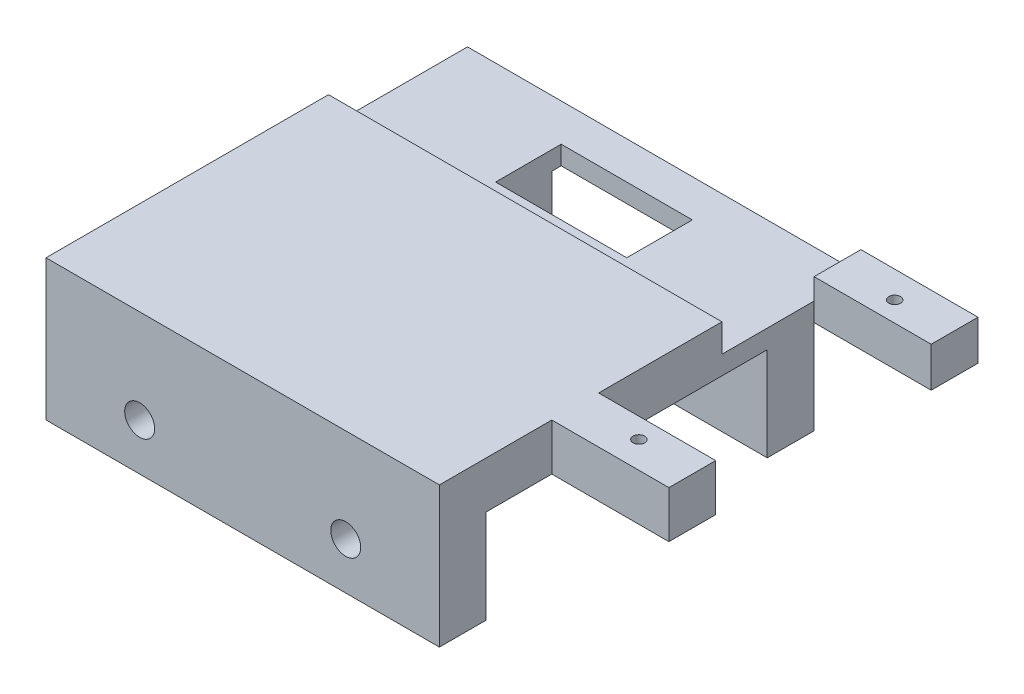
ISO-10303-21;
HEADER;
FILE_DESCRIPTION(('STEP AP214'),'2;1');
FILE_NAME('part.step','',(''),(''),'','','');
FILE_SCHEMA(('AUTOMOTIVE_DESIGN { 1 0 10303 214 1 1 1 1 }'));
ENDSEC;
DATA;
#1=APPLICATION_CONTEXT('core data for automotive mechanical design processes');
#2=APPLICATION_PROTOCOL_DEFINITION('international standard','automotive_design',2000,#1);
#3=PRODUCT_CONTEXT('',#1,'mechanical');
#4=PRODUCT('Part','Part','',(#3));
#5=PRODUCT_RELATED_PRODUCT_CATEGORY('part','',(#4));
#6=PRODUCT_DEFINITION_FORMATION('','',#4);
#7=PRODUCT_DEFINITION_CONTEXT('part definition',#1,'design');
#8=PRODUCT_DEFINITION('design','',#6,#7);
#9=PRODUCT_DEFINITION_SHAPE('','',#8);
#10=(LENGTH_UNIT() NAMED_UNIT(*) SI_UNIT(.MILLI.,.METRE.));
#11=(NAMED_UNIT(*) PLANE_ANGLE_UNIT() SI_UNIT($,.RADIAN.));
#12=(NAMED_UNIT(*) SI_UNIT($,.STERADIAN.) SOLID_ANGLE_UNIT());
#13=UNCERTAINTY_MEASURE_WITH_UNIT(LENGTH_MEASURE(1.E-05),#10,'distance_accuracy_value','');
#14=(GEOMETRIC_REPRESENTATION_CONTEXT(3) GLOBAL_UNCERTAINTY_ASSIGNED_CONTEXT((#13)) GLOBAL_UNIT_ASSIGNED_CONTEXT((#10,
#11,#12)) REPRESENTATION_CONTEXT('',''));
#15=CARTESIAN_POINT('',(0.,0.,0.));
#16=DIRECTION('',(0.,0.,1.));
#17=DIRECTION('',(1.,0.,0.));
#18=AXIS2_PLACEMENT_3D('',#15,#16,#17);
#19=CARTESIAN_POINT('',(42.,5.,0.));
#20=DIRECTION('',(-1.,0.,0.));
#21=DIRECTION('',(0.,0.,1.));
#22=AXIS2_PLACEMENT_3D('',#19,#20,#21);
#23=PLANE('',#22);
#24=DIRECTION('',(0.,-1.,0.));
#25=VECTOR('',#24,1.);
#26=CARTESIAN_POINT('',(42.,0.,5.));
#27=LINE('',#26,#25);
#28=CARTESIAN_POINT('',(42.,2.,5.));
#29=VERTEX_POINT('',#28);
#30=CARTESIAN_POINT('',(42.,0.,5.));
#31=VERTEX_POINT('',#30);
#32=EDGE_CURVE('E259',#29,#31,#27,.T.);
#33=ORIENTED_EDGE('',*,*,#32,.F.);
#34=DIRECTION('',(0.,0.,-1.));
#35=VECTOR('',#34,1.);
#36=CARTESIAN_POINT('',(42.,2.,0.));
#37=LINE('',#36,#35);
#38=CARTESIAN_POINT('',(42.,2.,14.8381003814202));
#39=VERTEX_POINT('',#38);
#40=EDGE_CURVE('E324',#39,#29,#37,.T.);
#41=ORIENTED_EDGE('',*,*,#40,.F.);
#42=DIRECTION('',(0.,1.,0.));
#43=VECTOR('',#42,1.);
#44=CARTESIAN_POINT('',(42.,2.,14.8381003814202));
#45=LINE('',#44,#43);
#46=CARTESIAN_POINT('',(42.,5.,14.8381003814202));
#47=VERTEX_POINT('',#46);
#48=EDGE_CURVE('E332',#39,#47,#45,.T.);
#49=ORIENTED_EDGE('',*,*,#48,.T.);
#50=DIRECTION('',(0.,0.,-1.));
#51=VECTOR('',#50,1.);
#52=CARTESIAN_POINT('',(42.,5.,0.));
#53=LINE('',#52,#51);
#54=CARTESIAN_POINT('',(42.,5.,28.));
#55=VERTEX_POINT('',#54);
#56=EDGE_CURVE('E445',#55,#47,#53,.T.);
#57=ORIENTED_EDGE('',*,*,#56,.F.);
#58=DIRECTION('',(0.,1.,0.));
#59=VECTOR('',#58,1.);
#60=CARTESIAN_POINT('',(42.,0.,28.));
#61=LINE('',#60,#59);
#62=CARTESIAN_POINT('',(42.,0.,28.));
#63=VERTEX_POINT('',#62);
#64=EDGE_CURVE('E68',#63,#55,#61,.T.);
#65=ORIENTED_EDGE('',*,*,#64,.F.);
#66=DIRECTION('',(0.,0.,-1.));
#67=VECTOR('',#66,1.);
#68=CARTESIAN_POINT('',(42.,0.,0.));
#69=LINE('',#68,#67);
#70=CARTESIAN_POINT('',(42.,0.,10.));
#71=VERTEX_POINT('',#70);
#72=EDGE_CURVE('E452',#63,#71,#69,.T.);
#73=ORIENTED_EDGE('',*,*,#72,.T.);
#74=DIRECTION('',(0.,1.,0.));
#75=VECTOR('',#74,1.);
#76=CARTESIAN_POINT('',(42.,-10.,10.));
#77=LINE('',#76,#75);
#78=CARTESIAN_POINT('',(42.,-10.,10.));
#79=VERTEX_POINT('',#78);
#80=EDGE_CURVE('E411',#79,#71,#77,.T.);
#81=ORIENTED_EDGE('',*,*,#80,.F.);
#82=DIRECTION('',(0.,0.,1.));
#83=VECTOR('',#82,1.);
#84=CARTESIAN_POINT('',(42.,-10.,10.));
#85=LINE('',#84,#83);
#86=CARTESIAN_POINT('',(42.,-10.,5.));
#87=VERTEX_POINT('',#86);
#88=EDGE_CURVE('E404',#87,#79,#85,.T.);
#89=ORIENTED_EDGE('',*,*,#88,.F.);
#90=DIRECTION('',(0.,1.,0.));
#91=VECTOR('',#90,1.);
#92=CARTESIAN_POINT('',(42.,-10.,5.));
#93=LINE('',#92,#91);
#94=EDGE_CURVE('E421',#87,#31,#93,.T.);
#95=ORIENTED_EDGE('',*,*,#94,.T.);
#96=EDGE_LOOP('',(#33,#41,#49,#57,#65,#73,#81,#89,#95));
#97=FACE_BOUND('',#96,.T.);
#98=ADVANCED_FACE('F51',(#97),#23,.F.);
#99=DIRECTION('',(0.,-1.,0.));
#100=VECTOR('',#99,1.);
#101=CARTESIAN_POINT('',(42.,0.,33.));
#102=LINE('',#101,#100);
#103=CARTESIAN_POINT('',(42.,5.,33.));
#104=VERTEX_POINT('',#103);
#105=CARTESIAN_POINT('',(42.,0.,33.));
#106=VERTEX_POINT('',#105);
#107=EDGE_CURVE('E260',#104,#106,#102,.T.);
#108=ORIENTED_EDGE('',*,*,#107,.F.);
#109=CARTESIAN_POINT('',(42.,5.,45.));
#110=VERTEX_POINT('',#109);
#111=EDGE_CURVE('E446',#110,#104,#53,.T.);
#112=ORIENTED_EDGE('',*,*,#111,.F.);
#113=DIRECTION('',(0.,-1.,0.));
#114=VECTOR('',#113,1.);
#115=CARTESIAN_POINT('',(42.,5.,45.));
#116=LINE('',#115,#114);
#117=CARTESIAN_POINT('',(42.,-10.,45.));
#118=VERTEX_POINT('',#117);
#119=EDGE_CURVE('E456',#110,#118,#116,.T.);
#120=ORIENTED_EDGE('',*,*,#119,.T.);
#121=DIRECTION('',(0.,0.,1.));
#122=VECTOR('',#121,1.);
#123=CARTESIAN_POINT('',(42.,-10.,45.));
#124=LINE('',#123,#122);
#125=CARTESIAN_POINT('',(42.,-10.,40.));
#126=VERTEX_POINT('',#125);
#127=EDGE_CURVE('E431',#126,#118,#124,.T.);
#128=ORIENTED_EDGE('',*,*,#127,.F.);
#129=DIRECTION('',(0.,1.,0.));
#130=VECTOR('',#129,1.);
#131=CARTESIAN_POINT('',(42.,-10.,40.));
#132=LINE('',#131,#130);
#133=CARTESIAN_POINT('',(42.,0.,40.));
#134=VERTEX_POINT('',#133);
#135=EDGE_CURVE('E437',#126,#134,#132,.T.);
#136=ORIENTED_EDGE('',*,*,#135,.T.);
#137=EDGE_CURVE('E76',#134,#106,#69,.T.);
#138=ORIENTED_EDGE('',*,*,#137,.T.);
#139=EDGE_LOOP('',(#108,#112,#120,#128,#136,#138));
#140=FACE_BOUND('',#139,.T.);
#141=ADVANCED_FACE('F474',(#140),#23,.F.);
#142=CARTESIAN_POINT('',(0.,-5.,35.));
#143=DIRECTION('',(1.,0.,0.));
#144=DIRECTION('',(0.,0.,-1.));
#145=AXIS2_PLACEMENT_3D('',#142,#143,#144);
#146=CYLINDRICAL_SURFACE('',#145,1.75);
#147=CARTESIAN_POINT('',(0.,-5.,35.));
#148=DIRECTION('',(1.,0.,0.));
#149=DIRECTION('',(0.,0.,-1.));
#150=AXIS2_PLACEMENT_3D('',#147,#148,#149);
#151=CIRCLE('',#150,1.75);
#152=CARTESIAN_POINT('',(0.,-5.,33.25));
#153=VERTEX_POINT('',#152);
#154=EDGE_CURVE('E298',#153,#153,#151,.T.);
#155=ORIENTED_EDGE('',*,*,#154,.F.);
#156=EDGE_LOOP('',(#155));
#157=FACE_BOUND('',#156,.T.);
#158=CARTESIAN_POINT('',(3.,-5.,35.));
#159=DIRECTION('',(1.,0.,0.));
#160=DIRECTION('',(0.,0.,-1.));
#161=AXIS2_PLACEMENT_3D('',#158,#159,#160);
#162=CIRCLE('',#161,1.75);
#163=CARTESIAN_POINT('',(3.,-5.,33.25));
#164=VERTEX_POINT('',#163);
#165=EDGE_CURVE('E295',#164,#164,#162,.F.);
#166=ORIENTED_EDGE('',*,*,#165,.F.);
#167=EDGE_LOOP('',(#166));
#168=FACE_BOUND('',#167,.T.);
#169=ADVANCED_FACE('F471',(#157,#168),#146,.F.);
#170=CARTESIAN_POINT('',(0.,0.,0.));
#171=DIRECTION('',(0.,1.,0.));
#172=DIRECTION('',(0.,0.,1.));
#173=AXIS2_PLACEMENT_3D('',#170,#171,#172);
#174=PLANE('',#173);
#175=CARTESIAN_POINT('',(48.45,0.,30.1500000000016));
#176=DIRECTION('',(0.,-1.,0.));
#177=DIRECTION('',(0.,0.,-1.));
#178=AXIS2_PLACEMENT_3D('',#175,#176,#177);
#179=CIRCLE('',#178,0.624999999999977);
#180=CARTESIAN_POINT('',(48.45,0.,29.5250000000016));
#181=VERTEX_POINT('',#180);
#182=EDGE_CURVE('E634',#181,#181,#179,.T.);
#183=ORIENTED_EDGE('',*,*,#182,.F.);
#184=EDGE_LOOP('',(#183));
#185=FACE_BOUND('',#184,.T.);
#186=DIRECTION('',(0.,0.,1.));
#187=VECTOR('',#186,1.);
#188=CARTESIAN_POINT('',(5.,0.,10.));
#189=LINE('',#188,#187);
#190=CARTESIAN_POINT('',(5.,0.,10.));
#191=VERTEX_POINT('',#190);
#192=CARTESIAN_POINT('',(5.,0.,40.));
#193=VERTEX_POINT('',#192);
#194=EDGE_CURVE('E301',#191,#193,#189,.T.);
#195=ORIENTED_EDGE('',*,*,#194,.F.);
#196=DIRECTION('',(-1.,0.,0.));
#197=VECTOR('',#196,1.);
#198=CARTESIAN_POINT('',(0.,0.,10.));
#199=LINE('',#198,#197);
#200=CARTESIAN_POINT('',(14.,0.,10.));
#201=VERTEX_POINT('',#200);
#202=EDGE_CURVE('E415',#201,#191,#199,.T.);
#203=ORIENTED_EDGE('',*,*,#202,.F.);
#204=DIRECTION('',(0.,0.,1.));
#205=VECTOR('',#204,1.);
#206=CARTESIAN_POINT('',(14.,0.,0.));
#207=LINE('',#206,#205);
#208=CARTESIAN_POINT('',(14.,0.,11.));
#209=VERTEX_POINT('',#208);
#210=EDGE_CURVE('E353',#201,#209,#207,.T.);
#211=ORIENTED_EDGE('',*,*,#210,.T.);
#212=DIRECTION('',(1.,0.,0.));
#213=VECTOR('',#212,1.);
#214=CARTESIAN_POINT('',(0.,0.,11.));
#215=LINE('',#214,#213);
#216=CARTESIAN_POINT('',(28.,0.,11.));
#217=VERTEX_POINT('',#216);
#218=EDGE_CURVE('E374',#209,#217,#215,.T.);
#219=ORIENTED_EDGE('',*,*,#218,.T.);
#220=DIRECTION('',(0.,0.,-1.));
#221=VECTOR('',#220,1.);
#222=CARTESIAN_POINT('',(28.,0.,0.));
#223=LINE('',#222,#221);
#224=CARTESIAN_POINT('',(28.,0.,10.));
#225=VERTEX_POINT('',#224);
#226=EDGE_CURVE('E365',#217,#225,#223,.T.);
#227=ORIENTED_EDGE('',*,*,#226,.T.);
#228=EDGE_CURVE('E416',#71,#225,#199,.T.);
#229=ORIENTED_EDGE('',*,*,#228,.F.);
#230=ORIENTED_EDGE('',*,*,#72,.F.);
#231=DIRECTION('',(-1.,0.,0.));
#232=VECTOR('',#231,1.);
#233=CARTESIAN_POINT('',(54.5,0.,28.));
#234=LINE('',#233,#232);
#235=CARTESIAN_POINT('',(54.5,0.,28.));
#236=VERTEX_POINT('',#235);
#237=EDGE_CURVE('E286',#236,#63,#234,.T.);
#238=ORIENTED_EDGE('',*,*,#237,.F.);
#239=DIRECTION('',(0.,0.,-1.));
#240=VECTOR('',#239,1.);
#241=CARTESIAN_POINT('',(54.5,0.,33.));
#242=LINE('',#241,#240);
#243=CARTESIAN_POINT('',(54.5,0.,33.));
#244=VERTEX_POINT('',#243);
#245=EDGE_CURVE('E273',#244,#236,#242,.T.);
#246=ORIENTED_EDGE('',*,*,#245,.F.);
#247=DIRECTION('',(-1.,0.,0.));
#248=VECTOR('',#247,1.);
#249=CARTESIAN_POINT('',(54.5,0.,33.));
#250=LINE('',#249,#248);
#251=EDGE_CURVE('E289',#244,#106,#250,.T.);
#252=ORIENTED_EDGE('',*,*,#251,.T.);
#253=ORIENTED_EDGE('',*,*,#137,.F.);
#254=DIRECTION('',(1.,0.,0.));
#255=VECTOR('',#254,1.);
#256=CARTESIAN_POINT('',(0.,0.,40.));
#257=LINE('',#256,#255);
#258=EDGE_CURVE('E426',#193,#134,#257,.T.);
#259=ORIENTED_EDGE('',*,*,#258,.F.);
#260=EDGE_LOOP('',(#195,#203,#211,#219,#227,#229,#230,#238,#246,#252,#253,#259));
#261=FACE_BOUND('',#260,.T.);
#262=ADVANCED_FACE('F473',(#185,#261),#174,.F.);
#263=CARTESIAN_POINT('',(0.,-10.,40.));
#264=DIRECTION('',(0.,0.,1.));
#265=DIRECTION('',(1.,0.,0.));
#266=AXIS2_PLACEMENT_3D('',#263,#264,#265);
#267=PLANE('',#266);
#268=CARTESIAN_POINT('',(10.,-5.,40.));
#269=DIRECTION('',(0.,0.,1.));
#270=DIRECTION('',(1.,0.,0.));
#271=AXIS2_PLACEMENT_3D('',#268,#269,#270);
#272=CIRCLE('',#271,1.6);
#273=CARTESIAN_POINT('',(11.6,-5.,40.));
#274=VERTEX_POINT('',#273);
#275=EDGE_CURVE('E393',#274,#274,#272,.T.);
#276=ORIENTED_EDGE('',*,*,#275,.T.);
#277=EDGE_LOOP('',(#276));
#278=FACE_BOUND('',#277,.T.);
#279=CARTESIAN_POINT('',(32.,-5.,40.));
#280=DIRECTION('',(0.,0.,1.));
#281=DIRECTION('',(1.,0.,0.));
#282=AXIS2_PLACEMENT_3D('',#279,#280,#281);
#283=CIRCLE('',#282,1.6);
#284=CARTESIAN_POINT('',(33.6,-5.,40.));
#285=VERTEX_POINT('',#284);
#286=EDGE_CURVE('E397',#285,#285,#283,.T.);
#287=ORIENTED_EDGE('',*,*,#286,.T.);
#288=EDGE_LOOP('',(#287));
#289=FACE_BOUND('',#288,.T.);
#290=DIRECTION('',(0.,1.,0.));
#291=VECTOR('',#290,1.);
#292=CARTESIAN_POINT('',(5.,-10.,40.));
#293=LINE('',#292,#291);
#294=CARTESIAN_POINT('',(5.,-10.,40.));
#295=VERTEX_POINT('',#294);
#296=EDGE_CURVE('E310',#295,#193,#293,.T.);
#297=ORIENTED_EDGE('',*,*,#296,.T.);
#298=ORIENTED_EDGE('',*,*,#258,.T.);
#299=ORIENTED_EDGE('',*,*,#135,.F.);
#300=DIRECTION('',(1.,0.,0.));
#301=VECTOR('',#300,1.);
#302=CARTESIAN_POINT('',(0.,-10.,40.));
#303=LINE('',#302,#301);
#304=EDGE_CURVE('E429',#295,#126,#303,.T.);
#305=ORIENTED_EDGE('',*,*,#304,.F.);
#306=EDGE_LOOP('',(#297,#298,#299,#305));
#307=FACE_BOUND('',#306,.T.);
#308=ADVANCED_FACE('F482',(#278,#289,#307),#267,.F.);
#309=CARTESIAN_POINT('',(0.,-10.,10.));
#310=DIRECTION('',(0.,0.,-1.));
#311=DIRECTION('',(-1.,0.,0.));
#312=AXIS2_PLACEMENT_3D('',#309,#310,#311);
#313=PLANE('',#312);
#314=CARTESIAN_POINT('',(10.,-5.,10.));
#315=DIRECTION('',(0.,0.,-1.));
#316=DIRECTION('',(-1.,0.,0.));
#317=AXIS2_PLACEMENT_3D('',#314,#315,#316);
#318=CIRCLE('',#317,1.6);
#319=CARTESIAN_POINT('',(8.4,-5.,10.));
#320=VERTEX_POINT('',#319);
#321=EDGE_CURVE('E384',#320,#320,#318,.T.);
#322=ORIENTED_EDGE('',*,*,#321,.T.);
#323=EDGE_LOOP('',(#322));
#324=FACE_BOUND('',#323,.T.);
#325=DIRECTION('',(0.,1.,0.));
#326=VECTOR('',#325,1.);
#327=CARTESIAN_POINT('',(5.,-10.,10.));
#328=LINE('',#327,#326);
#329=CARTESIAN_POINT('',(5.,-10.,10.));
#330=VERTEX_POINT('',#329);
#331=EDGE_CURVE('E314',#330,#191,#328,.T.);
#332=ORIENTED_EDGE('',*,*,#331,.F.);
#333=DIRECTION('',(-1.,0.,0.));
#334=VECTOR('',#333,1.);
#335=CARTESIAN_POINT('',(0.,-10.,10.));
#336=LINE('',#335,#334);
#337=CARTESIAN_POINT('',(14.,-10.,10.));
#338=VERTEX_POINT('',#337);
#339=EDGE_CURVE('E407',#338,#330,#336,.T.);
#340=ORIENTED_EDGE('',*,*,#339,.F.);
#341=DIRECTION('',(0.,1.,0.));
#342=VECTOR('',#341,1.);
#343=CARTESIAN_POINT('',(14.,-10.,10.));
#344=LINE('',#343,#342);
#345=EDGE_CURVE('E345',#338,#201,#344,.T.);
#346=ORIENTED_EDGE('',*,*,#345,.T.);
#347=ORIENTED_EDGE('',*,*,#202,.T.);
#348=EDGE_LOOP('',(#332,#340,#346,#347));
#349=FACE_BOUND('',#348,.T.);
#350=ADVANCED_FACE('F538',(#324,#349),#313,.F.);
#351=CARTESIAN_POINT('',(0.,5.,0.));
#352=DIRECTION('',(0.,0.,1.));
#353=DIRECTION('',(1.,0.,0.));
#354=AXIS2_PLACEMENT_3D('',#351,#352,#353);
#355=PLANE('',#354);
#356=DIRECTION('',(-1.,0.,0.));
#357=VECTOR('',#356,1.);
#358=CARTESIAN_POINT('',(0.,2.,0.));
#359=LINE('',#358,#357);
#360=CARTESIAN_POINT('',(42.,2.,0.));
#361=VERTEX_POINT('',#360);
#362=CARTESIAN_POINT('',(0.,2.,0.));
#363=VERTEX_POINT('',#362);
#364=EDGE_CURVE('E327',#361,#363,#359,.T.);
#365=ORIENTED_EDGE('',*,*,#364,.F.);
#366=DIRECTION('',(0.,1.,0.));
#367=VECTOR('',#366,1.);
#368=CARTESIAN_POINT('',(42.,0.,0.));
#369=LINE('',#368,#367);
#370=CARTESIAN_POINT('',(42.,4.25509355331588,0.));
#371=VERTEX_POINT('',#370);
#372=EDGE_CURVE('E645',#361,#371,#369,.T.);
#373=ORIENTED_EDGE('',*,*,#372,.T.);
#374=DIRECTION('',(-1.,0.,0.));
#375=VECTOR('',#374,1.);
#376=CARTESIAN_POINT('',(54.5,4.25509355331588,0.));
#377=LINE('',#376,#375);
#378=CARTESIAN_POINT('',(54.5,4.25509355331588,0.));
#379=VERTEX_POINT('',#378);
#380=EDGE_CURVE('E261',#379,#371,#377,.T.);
#381=ORIENTED_EDGE('',*,*,#380,.F.);
#382=DIRECTION('',(0.,1.,0.));
#383=VECTOR('',#382,1.);
#384=CARTESIAN_POINT('',(54.5,0.,0.));
#385=LINE('',#384,#383);
#386=CARTESIAN_POINT('',(54.5,0.,0.));
#387=VERTEX_POINT('',#386);
#388=EDGE_CURVE('E244',#387,#379,#385,.T.);
#389=ORIENTED_EDGE('',*,*,#388,.F.);
#390=DIRECTION('',(-1.,0.,0.));
#391=VECTOR('',#390,1.);
#392=CARTESIAN_POINT('',(0.,0.,0.));
#393=LINE('',#392,#391);
#394=CARTESIAN_POINT('',(0.,0.,0.));
#395=VERTEX_POINT('',#394);
#396=EDGE_CURVE('E241',#387,#395,#393,.T.);
#397=ORIENTED_EDGE('',*,*,#396,.T.);
#398=DIRECTION('',(0.,-1.,0.));
#399=VECTOR('',#398,1.);
#400=CARTESIAN_POINT('',(0.,5.,0.));
#401=LINE('',#400,#399);
#402=EDGE_CURVE('E449',#363,#395,#401,.T.);
#403=ORIENTED_EDGE('',*,*,#402,.F.);
#404=EDGE_LOOP('',(#365,#373,#381,#389,#397,#403));
#405=FACE_BOUND('',#404,.T.);
#406=ADVANCED_FACE('F494',(#405),#355,.F.);
#407=CARTESIAN_POINT('',(14.,5.,4.00000000000001));
#408=DIRECTION('',(0.,0.,-1.));
#409=DIRECTION('',(-1.,0.,0.));
#410=AXIS2_PLACEMENT_3D('',#407,#408,#409);
#411=PLANE('',#410);
#412=DIRECTION('',(1.,0.,0.));
#413=VECTOR('',#412,1.);
#414=CARTESIAN_POINT('',(14.,2.,4.00000000000001));
#415=LINE('',#414,#413);
#416=CARTESIAN_POINT('',(14.,2.,4.00000000000001));
#417=VERTEX_POINT('',#416);
#418=CARTESIAN_POINT('',(28.,2.,4.00000000000001));
#419=VERTEX_POINT('',#418);
#420=EDGE_CURVE('E338',#417,#419,#415,.T.);
#421=ORIENTED_EDGE('',*,*,#420,.F.);
#422=DIRECTION('',(0.,-1.,0.));
#423=VECTOR('',#422,1.);
#424=CARTESIAN_POINT('',(14.,5.,4.00000000000001));
#425=LINE('',#424,#423);
#426=CARTESIAN_POINT('',(14.,0.,4.00000000000001));
#427=VERTEX_POINT('',#426);
#428=EDGE_CURVE('E346',#417,#427,#425,.T.);
#429=ORIENTED_EDGE('',*,*,#428,.T.);
#430=DIRECTION('',(-1.,0.,0.));
#431=VECTOR('',#430,1.);
#432=CARTESIAN_POINT('',(0.,0.,4.00000000000001));
#433=LINE('',#432,#431);
#434=CARTESIAN_POINT('',(28.,0.,4.00000000000001));
#435=VERTEX_POINT('',#434);
#436=EDGE_CURVE('E377',#435,#427,#433,.T.);
#437=ORIENTED_EDGE('',*,*,#436,.F.);
#438=DIRECTION('',(0.,-1.,0.));
#439=VECTOR('',#438,1.);
#440=CARTESIAN_POINT('',(28.,5.,4.00000000000001));
#441=LINE('',#440,#439);
#442=EDGE_CURVE('E343',#419,#435,#441,.T.);
#443=ORIENTED_EDGE('',*,*,#442,.F.);
#444=EDGE_LOOP('',(#421,#429,#437,#443));
#445=FACE_BOUND('',#444,.T.);
#446=ADVANCED_FACE('F587',(#445),#411,.F.);
#447=CARTESIAN_POINT('',(14.,5.,11.));
#448=DIRECTION('',(0.,0.,1.));
#449=DIRECTION('',(1.,0.,0.));
#450=AXIS2_PLACEMENT_3D('',#447,#448,#449);
#451=PLANE('',#450);
#452=DIRECTION('',(-1.,0.,0.));
#453=VECTOR('',#452,1.);
#454=CARTESIAN_POINT('',(14.,2.,11.));
#455=LINE('',#454,#453);
#456=CARTESIAN_POINT('',(28.,2.,11.));
#457=VERTEX_POINT('',#456);
#458=CARTESIAN_POINT('',(14.,2.,11.));
#459=VERTEX_POINT('',#458);
#460=EDGE_CURVE('E335',#457,#459,#455,.T.);
#461=ORIENTED_EDGE('',*,*,#460,.F.);
#462=DIRECTION('',(0.,-1.,0.));
#463=VECTOR('',#462,1.);
#464=CARTESIAN_POINT('',(28.,5.,11.));
#465=LINE('',#464,#463);
#466=EDGE_CURVE('E342',#457,#217,#465,.T.);
#467=ORIENTED_EDGE('',*,*,#466,.T.);
#468=ORIENTED_EDGE('',*,*,#218,.F.);
#469=DIRECTION('',(0.,-1.,0.));
#470=VECTOR('',#469,1.);
#471=CARTESIAN_POINT('',(14.,5.,11.));
#472=LINE('',#471,#470);
#473=EDGE_CURVE('E348',#459,#209,#472,.T.);
#474=ORIENTED_EDGE('',*,*,#473,.F.);
#475=EDGE_LOOP('',(#461,#467,#468,#474));
#476=FACE_BOUND('',#475,.T.);
#477=ADVANCED_FACE('F594',(#476),#451,.F.);
#478=CARTESIAN_POINT('',(28.,5.,11.));
#479=DIRECTION('',(1.,0.,0.));
#480=DIRECTION('',(0.,0.,-1.));
#481=AXIS2_PLACEMENT_3D('',#478,#479,#480);
#482=PLANE('',#481);
#483=DIRECTION('',(0.,0.,1.));
#484=VECTOR('',#483,1.);
#485=CARTESIAN_POINT('',(28.,2.,11.));
#486=LINE('',#485,#484);
#487=EDGE_CURVE('E340',#419,#457,#486,.T.);
#488=ORIENTED_EDGE('',*,*,#487,.F.);
#489=ORIENTED_EDGE('',*,*,#442,.T.);
#490=DIRECTION('',(0.,0.,-1.));
#491=VECTOR('',#490,1.);
#492=CARTESIAN_POINT('',(28.,0.,0.));
#493=LINE('',#492,#491);
#494=CARTESIAN_POINT('',(28.,0.,5.));
#495=VERTEX_POINT('',#494);
#496=EDGE_CURVE('E371',#495,#435,#493,.T.);
#497=ORIENTED_EDGE('',*,*,#496,.F.);
#498=DIRECTION('',(0.,1.,0.));
#499=VECTOR('',#498,1.);
#500=CARTESIAN_POINT('',(28.,-10.,5.));
#501=LINE('',#500,#499);
#502=CARTESIAN_POINT('',(28.,-10.,5.));
#503=VERTEX_POINT('',#502);
#504=EDGE_CURVE('E368',#503,#495,#501,.T.);
#505=ORIENTED_EDGE('',*,*,#504,.F.);
#506=DIRECTION('',(0.,0.,1.));
#507=VECTOR('',#506,1.);
#508=CARTESIAN_POINT('',(28.,-10.,0.));
#509=LINE('',#508,#507);
#510=CARTESIAN_POINT('',(28.,-10.,10.));
#511=VERTEX_POINT('',#510);
#512=EDGE_CURVE('E60',#503,#511,#509,.T.);
#513=ORIENTED_EDGE('',*,*,#512,.T.);
#514=DIRECTION('',(0.,-1.,0.));
#515=VECTOR('',#514,1.);
#516=CARTESIAN_POINT('',(28.,-10.,10.));
#517=LINE('',#516,#515);
#518=EDGE_CURVE('E362',#225,#511,#517,.T.);
#519=ORIENTED_EDGE('',*,*,#518,.F.);
#520=ORIENTED_EDGE('',*,*,#226,.F.);
#521=ORIENTED_EDGE('',*,*,#466,.F.);
#522=EDGE_LOOP('',(#488,#489,#497,#505,#513,#519,#520,#521));
#523=FACE_BOUND('',#522,.T.);
#524=ADVANCED_FACE('F582',(#523),#482,.F.);
#525=CARTESIAN_POINT('',(14.,5.,11.));
#526=DIRECTION('',(-1.,0.,0.));
#527=DIRECTION('',(0.,0.,1.));
#528=AXIS2_PLACEMENT_3D('',#525,#526,#527);
#529=PLANE('',#528);
#530=DIRECTION('',(0.,0.,-1.));
#531=VECTOR('',#530,1.);
#532=CARTESIAN_POINT('',(14.,2.,11.));
#533=LINE('',#532,#531);
#534=EDGE_CURVE('E13',#459,#417,#533,.T.);
#535=ORIENTED_EDGE('',*,*,#534,.F.);
#536=ORIENTED_EDGE('',*,*,#473,.T.);
#537=ORIENTED_EDGE('',*,*,#210,.F.);
#538=ORIENTED_EDGE('',*,*,#345,.F.);
#539=DIRECTION('',(0.,0.,-1.));
#540=VECTOR('',#539,1.);
#541=CARTESIAN_POINT('',(14.,-10.,0.));
#542=LINE('',#541,#540);
#543=CARTESIAN_POINT('',(14.,-10.,5.));
#544=VERTEX_POINT('',#543);
#545=EDGE_CURVE('E460',#338,#544,#542,.T.);
#546=ORIENTED_EDGE('',*,*,#545,.T.);
#547=DIRECTION('',(0.,-1.,0.));
#548=VECTOR('',#547,1.);
#549=CARTESIAN_POINT('',(14.,-10.,5.));
#550=LINE('',#549,#548);
#551=CARTESIAN_POINT('',(14.,0.,5.));
#552=VERTEX_POINT('',#551);
#553=EDGE_CURVE('E356',#552,#544,#550,.T.);
#554=ORIENTED_EDGE('',*,*,#553,.F.);
#555=DIRECTION('',(0.,0.,1.));
#556=VECTOR('',#555,1.);
#557=CARTESIAN_POINT('',(14.,0.,0.));
#558=LINE('',#557,#556);
#559=EDGE_CURVE('E359',#427,#552,#558,.T.);
#560=ORIENTED_EDGE('',*,*,#559,.F.);
#561=ORIENTED_EDGE('',*,*,#428,.F.);
#562=EDGE_LOOP('',(#535,#536,#537,#538,#546,#554,#560,#561));
#563=FACE_BOUND('',#562,.T.);
#564=ADVANCED_FACE('F532',(#563),#529,.F.);
#565=CARTESIAN_POINT('',(0.,-10.,5.));
#566=DIRECTION('',(0.,0.,1.));
#567=DIRECTION('',(1.,0.,0.));
#568=AXIS2_PLACEMENT_3D('',#565,#566,#567);
#569=PLANE('',#568);
#570=CARTESIAN_POINT('',(32.,-5.,5.));
#571=DIRECTION('',(0.,0.,-1.));
#572=DIRECTION('',(-1.,0.,0.));
#573=AXIS2_PLACEMENT_3D('',#570,#571,#572);
#574=CIRCLE('',#573,1.6);
#575=CARTESIAN_POINT('',(30.4,-5.,5.));
#576=VERTEX_POINT('',#575);
#577=EDGE_CURVE('E385',#576,#576,#574,.T.);
#578=ORIENTED_EDGE('',*,*,#577,.F.);
#579=EDGE_LOOP('',(#578));
#580=FACE_BOUND('',#579,.T.);
#581=DIRECTION('',(1.,0.,0.));
#582=VECTOR('',#581,1.);
#583=CARTESIAN_POINT('',(0.,-10.,5.));
#584=LINE('',#583,#582);
#585=EDGE_CURVE('E405',#503,#87,#584,.T.);
#586=ORIENTED_EDGE('',*,*,#585,.F.);
#587=ORIENTED_EDGE('',*,*,#504,.T.);
#588=DIRECTION('',(1.,0.,0.));
#589=VECTOR('',#588,1.);
#590=CARTESIAN_POINT('',(0.,0.,5.));
#591=LINE('',#590,#589);
#592=EDGE_CURVE('E400',#495,#31,#591,.T.);
#593=ORIENTED_EDGE('',*,*,#592,.T.);
#594=ORIENTED_EDGE('',*,*,#94,.F.);
#595=EDGE_LOOP('',(#586,#587,#593,#594));
#596=FACE_BOUND('',#595,.T.);
#597=ADVANCED_FACE('F579',(#580,#596),#569,.F.);
#598=CARTESIAN_POINT('',(32.,-5.,10.));
#599=DIRECTION('',(0.,0.,-1.));
#600=DIRECTION('',(-1.,0.,0.));
#601=AXIS2_PLACEMENT_3D('',#598,#599,#600);
#602=CIRCLE('',#601,1.6);
#603=CARTESIAN_POINT('',(30.4,-5.,10.));
#604=VERTEX_POINT('',#603);
#605=EDGE_CURVE('E396',#604,#604,#602,.T.);
#606=ORIENTED_EDGE('',*,*,#605,.T.);
#607=EDGE_LOOP('',(#606));
#608=FACE_BOUND('',#607,.T.);
#609=ORIENTED_EDGE('',*,*,#228,.T.);
#610=ORIENTED_EDGE('',*,*,#518,.T.);
#611=EDGE_CURVE('E408',#79,#511,#336,.T.);
#612=ORIENTED_EDGE('',*,*,#611,.F.);
#613=ORIENTED_EDGE('',*,*,#80,.T.);
#614=EDGE_LOOP('',(#609,#610,#612,#613));
#615=FACE_BOUND('',#614,.T.);
#616=ADVANCED_FACE('F571',(#608,#615),#313,.F.);
#617=CARTESIAN_POINT('',(0.,-10.,0.));
#618=DIRECTION('',(0.,-1.,0.));
#619=DIRECTION('',(0.,0.,-1.));
#620=AXIS2_PLACEMENT_3D('',#617,#618,#619);
#621=PLANE('',#620);
#622=ORIENTED_EDGE('',*,*,#512,.F.);
#623=ORIENTED_EDGE('',*,*,#585,.T.);
#624=ORIENTED_EDGE('',*,*,#88,.T.);
#625=ORIENTED_EDGE('',*,*,#611,.T.);
#626=EDGE_LOOP('',(#622,#623,#624,#625));
#627=FACE_BOUND('',#626,.T.);
#628=ADVANCED_FACE('F574',(#627),#621,.T.);
#629=CARTESIAN_POINT('',(48.45,0.,2.85000000000161));
#630=DIRECTION('',(0.,-1.,0.));
#631=DIRECTION('',(0.,0.,-1.));
#632=AXIS2_PLACEMENT_3D('',#629,#630,#631);
#633=CIRCLE('',#632,0.624999999999977);
#634=CARTESIAN_POINT('',(48.45,0.,2.22500000000163));
#635=VERTEX_POINT('',#634);
#636=EDGE_CURVE('E632',#635,#635,#633,.T.);
#637=ORIENTED_EDGE('',*,*,#636,.F.);
#638=EDGE_LOOP('',(#637));
#639=FACE_BOUND('',#638,.T.);
#640=ORIENTED_EDGE('',*,*,#592,.F.);
#641=ORIENTED_EDGE('',*,*,#496,.T.);
#642=ORIENTED_EDGE('',*,*,#436,.T.);
#643=ORIENTED_EDGE('',*,*,#559,.T.);
#644=CARTESIAN_POINT('',(0.,0.,5.));
#645=VERTEX_POINT('',#644);
#646=EDGE_CURVE('E412',#645,#552,#591,.T.);
#647=ORIENTED_EDGE('',*,*,#646,.F.);
#648=DIRECTION('',(0.,0.,1.));
#649=VECTOR('',#648,1.);
#650=CARTESIAN_POINT('',(0.,0.,0.));
#651=LINE('',#650,#649);
#652=EDGE_CURVE('E440',#395,#645,#651,.T.);
#653=ORIENTED_EDGE('',*,*,#652,.F.);
#654=ORIENTED_EDGE('',*,*,#396,.F.);
#655=DIRECTION('',(0.,0.,-1.));
#656=VECTOR('',#655,1.);
#657=CARTESIAN_POINT('',(54.5,0.,5.));
#658=LINE('',#657,#656);
#659=CARTESIAN_POINT('',(54.5,0.,5.));
#660=VERTEX_POINT('',#659);
#661=EDGE_CURVE('E232',#660,#387,#658,.T.);
#662=ORIENTED_EDGE('',*,*,#661,.F.);
#663=DIRECTION('',(-1.,0.,0.));
#664=VECTOR('',#663,1.);
#665=CARTESIAN_POINT('',(54.5,0.,5.));
#666=LINE('',#665,#664);
#667=EDGE_CURVE('E237',#660,#31,#666,.T.);
#668=ORIENTED_EDGE('',*,*,#667,.T.);
#669=EDGE_LOOP('',(#640,#641,#642,#643,#647,#653,#654,#662,#668));
#670=FACE_BOUND('',#669,.T.);
#671=ADVANCED_FACE('F235',(#639,#670),#174,.F.);
#672=CARTESIAN_POINT('',(0.,5.,0.));
#673=DIRECTION('',(1.,0.,0.));
#674=DIRECTION('',(0.,0.,-1.));
#675=AXIS2_PLACEMENT_3D('',#672,#673,#674);
#676=PLANE('',#675);
#677=ORIENTED_EDGE('',*,*,#154,.T.);
#678=EDGE_LOOP('',(#677));
#679=FACE_BOUND('',#678,.T.);
#680=CARTESIAN_POINT('',(0.,-5.,15.));
#681=DIRECTION('',(1.,0.,0.));
#682=DIRECTION('',(0.,0.,-1.));
#683=AXIS2_PLACEMENT_3D('',#680,#681,#682);
#684=CIRCLE('',#683,1.75);
#685=CARTESIAN_POINT('',(0.,-5.,13.25));
#686=VERTEX_POINT('',#685);
#687=EDGE_CURVE('E302',#686,#686,#684,.T.);
#688=ORIENTED_EDGE('',*,*,#687,.T.);
#689=EDGE_LOOP('',(#688));
#690=FACE_BOUND('',#689,.T.);
#691=DIRECTION('',(0.,0.,1.));
#692=VECTOR('',#691,1.);
#693=CARTESIAN_POINT('',(0.,5.,0.));
#694=LINE('',#693,#692);
#695=CARTESIAN_POINT('',(0.,5.,14.8381003814202));
#696=VERTEX_POINT('',#695);
#697=CARTESIAN_POINT('',(0.,5.,45.));
#698=VERTEX_POINT('',#697);
#699=EDGE_CURVE('E441',#696,#698,#694,.T.);
#700=ORIENTED_EDGE('',*,*,#699,.F.);
#701=DIRECTION('',(0.,1.,0.));
#702=VECTOR('',#701,1.);
#703=CARTESIAN_POINT('',(0.,2.,14.8381003814202));
#704=LINE('',#703,#702);
#705=CARTESIAN_POINT('',(0.,2.,14.8381003814202));
#706=VERTEX_POINT('',#705);
#707=EDGE_CURVE('E329',#706,#696,#704,.T.);
#708=ORIENTED_EDGE('',*,*,#707,.F.);
#709=DIRECTION('',(0.,0.,1.));
#710=VECTOR('',#709,1.);
#711=CARTESIAN_POINT('',(0.,2.,0.));
#712=LINE('',#711,#710);
#713=EDGE_CURVE('E317',#363,#706,#712,.T.);
#714=ORIENTED_EDGE('',*,*,#713,.F.);
#715=ORIENTED_EDGE('',*,*,#402,.T.);
#716=ORIENTED_EDGE('',*,*,#652,.T.);
#717=DIRECTION('',(0.,1.,0.));
#718=VECTOR('',#717,1.);
#719=CARTESIAN_POINT('',(0.,-10.,5.));
#720=LINE('',#719,#718);
#721=CARTESIAN_POINT('',(0.,-10.,5.));
#722=VERTEX_POINT('',#721);
#723=EDGE_CURVE('E424',#722,#645,#720,.T.);
#724=ORIENTED_EDGE('',*,*,#723,.F.);
#725=DIRECTION('',(0.,0.,-1.));
#726=VECTOR('',#725,1.);
#727=CARTESIAN_POINT('',(0.,-10.,45.));
#728=LINE('',#727,#726);
#729=CARTESIAN_POINT('',(0.,-10.,45.));
#730=VERTEX_POINT('',#729);
#731=EDGE_CURVE('E427',#730,#722,#728,.T.);
#732=ORIENTED_EDGE('',*,*,#731,.F.);
#733=DIRECTION('',(0.,-1.,0.));
#734=VECTOR('',#733,1.);
#735=CARTESIAN_POINT('',(0.,5.,45.));
#736=LINE('',#735,#734);
#737=EDGE_CURVE('E458',#698,#730,#736,.T.);
#738=ORIENTED_EDGE('',*,*,#737,.F.);
#739=EDGE_LOOP('',(#700,#708,#714,#715,#716,#724,#732,#738));
#740=FACE_BOUND('',#739,.T.);
#741=ADVANCED_FACE('F53',(#679,#690,#740),#676,.F.);
#742=CARTESIAN_POINT('',(0.,5.,45.));
#743=DIRECTION('',(0.,0.,-1.));
#744=DIRECTION('',(-1.,0.,0.));
#745=AXIS2_PLACEMENT_3D('',#742,#743,#744);
#746=PLANE('',#745);
#747=CARTESIAN_POINT('',(32.,-5.,45.));
#748=DIRECTION('',(0.,0.,-1.));
#749=DIRECTION('',(-1.,0.,0.));
#750=AXIS2_PLACEMENT_3D('',#747,#748,#749);
#751=CIRCLE('',#750,1.6);
#752=CARTESIAN_POINT('',(30.4,-5.,45.));
#753=VERTEX_POINT('',#752);
#754=EDGE_CURVE('E381',#753,#753,#751,.T.);
#755=ORIENTED_EDGE('',*,*,#754,.T.);
#756=EDGE_LOOP('',(#755));
#757=FACE_BOUND('',#756,.T.);
#758=CARTESIAN_POINT('',(10.,-5.,45.));
#759=DIRECTION('',(0.,0.,-1.));
#760=DIRECTION('',(-1.,0.,0.));
#761=AXIS2_PLACEMENT_3D('',#758,#759,#760);
#762=CIRCLE('',#761,1.6);
#763=CARTESIAN_POINT('',(8.4,-5.,45.));
#764=VERTEX_POINT('',#763);
#765=EDGE_CURVE('E388',#764,#764,#762,.T.);
#766=ORIENTED_EDGE('',*,*,#765,.T.);
#767=EDGE_LOOP('',(#766));
#768=FACE_BOUND('',#767,.T.);
#769=ORIENTED_EDGE('',*,*,#737,.T.);
#770=DIRECTION('',(-1.,0.,0.));
#771=VECTOR('',#770,1.);
#772=CARTESIAN_POINT('',(0.,-10.,45.));
#773=LINE('',#772,#771);
#774=EDGE_CURVE('E434',#118,#730,#773,.T.);
#775=ORIENTED_EDGE('',*,*,#774,.F.);
#776=ORIENTED_EDGE('',*,*,#119,.F.);
#777=DIRECTION('',(1.,0.,0.));
#778=VECTOR('',#777,1.);
#779=CARTESIAN_POINT('',(0.,5.,45.));
#780=LINE('',#779,#778);
#781=EDGE_CURVE('E443',#698,#110,#780,.T.);
#782=ORIENTED_EDGE('',*,*,#781,.F.);
#783=EDGE_LOOP('',(#769,#775,#776,#782));
#784=FACE_BOUND('',#783,.T.);
#785=ADVANCED_FACE('F495',(#757,#768,#784),#746,.F.);
#786=CARTESIAN_POINT('',(0.,5.,0.));
#787=DIRECTION('',(0.,1.,0.));
#788=DIRECTION('',(0.,0.,1.));
#789=AXIS2_PLACEMENT_3D('',#786,#787,#788);
#790=PLANE('',#789);
#791=CARTESIAN_POINT('',(48.45,5.,30.1500000000016));
#792=DIRECTION('',(0.,-1.,0.));
#793=DIRECTION('',(0.,0.,-1.));
#794=AXIS2_PLACEMENT_3D('',#791,#792,#793);
#795=CIRCLE('',#794,0.624999999999977);
#796=CARTESIAN_POINT('',(48.45,5.,29.5250000000016));
#797=VERTEX_POINT('',#796);
#798=EDGE_CURVE('E637',#797,#797,#795,.T.);
#799=ORIENTED_EDGE('',*,*,#798,.T.);
#800=EDGE_LOOP('',(#799));
#801=FACE_BOUND('',#800,.T.);
#802=DIRECTION('',(1.,0.,0.));
#803=VECTOR('',#802,1.);
#804=CARTESIAN_POINT('',(0.,5.,14.8381003814202));
#805=LINE('',#804,#803);
#806=EDGE_CURVE('E316',#696,#47,#805,.T.);
#807=ORIENTED_EDGE('',*,*,#806,.F.);
#808=ORIENTED_EDGE('',*,*,#699,.T.);
#809=ORIENTED_EDGE('',*,*,#781,.T.);
#810=ORIENTED_EDGE('',*,*,#111,.T.);
#811=DIRECTION('',(-1.,0.,0.));
#812=VECTOR('',#811,1.);
#813=CARTESIAN_POINT('',(54.5,5.,33.));
#814=LINE('',#813,#812);
#815=CARTESIAN_POINT('',(54.5,5.,33.));
#816=VERTEX_POINT('',#815);
#817=EDGE_CURVE('E278',#816,#104,#814,.T.);
#818=ORIENTED_EDGE('',*,*,#817,.F.);
#819=DIRECTION('',(0.,0.,1.));
#820=VECTOR('',#819,1.);
#821=CARTESIAN_POINT('',(54.5,5.,33.));
#822=LINE('',#821,#820);
#823=CARTESIAN_POINT('',(54.5,5.,28.));
#824=VERTEX_POINT('',#823);
#825=EDGE_CURVE('E277',#824,#816,#822,.T.);
#826=ORIENTED_EDGE('',*,*,#825,.F.);
#827=DIRECTION('',(-1.,0.,0.));
#828=VECTOR('',#827,1.);
#829=CARTESIAN_POINT('',(54.5,5.,28.));
#830=LINE('',#829,#828);
#831=EDGE_CURVE('E283',#824,#55,#830,.T.);
#832=ORIENTED_EDGE('',*,*,#831,.T.);
#833=ORIENTED_EDGE('',*,*,#56,.T.);
#834=EDGE_LOOP('',(#807,#808,#809,#810,#818,#826,#832,#833));
#835=FACE_BOUND('',#834,.T.);
#836=ADVANCED_FACE('F497',(#801,#835),#790,.T.);
#837=ORIENTED_EDGE('',*,*,#731,.T.);
#838=EDGE_CURVE('E401',#722,#544,#584,.T.);
#839=ORIENTED_EDGE('',*,*,#838,.T.);
#840=ORIENTED_EDGE('',*,*,#545,.F.);
#841=ORIENTED_EDGE('',*,*,#339,.T.);
#842=DIRECTION('',(0.,0.,1.));
#843=VECTOR('',#842,1.);
#844=CARTESIAN_POINT('',(5.,-10.,10.));
#845=LINE('',#844,#843);
#846=EDGE_CURVE('E308',#330,#295,#845,.T.);
#847=ORIENTED_EDGE('',*,*,#846,.T.);
#848=ORIENTED_EDGE('',*,*,#304,.T.);
#849=ORIENTED_EDGE('',*,*,#127,.T.);
#850=ORIENTED_EDGE('',*,*,#774,.T.);
#851=EDGE_LOOP('',(#837,#839,#840,#841,#847,#848,#849,#850));
#852=FACE_BOUND('',#851,.T.);
#853=ADVANCED_FACE('F504',(#852),#621,.T.);
#854=CARTESIAN_POINT('',(10.,-5.,5.));
#855=DIRECTION('',(0.,0.,-1.));
#856=DIRECTION('',(-1.,0.,0.));
#857=AXIS2_PLACEMENT_3D('',#854,#855,#856);
#858=CIRCLE('',#857,1.6);
#859=CARTESIAN_POINT('',(8.4,-5.,5.));
#860=VERTEX_POINT('',#859);
#861=EDGE_CURVE('E380',#860,#860,#858,.T.);
#862=ORIENTED_EDGE('',*,*,#861,.F.);
#863=EDGE_LOOP('',(#862));
#864=FACE_BOUND('',#863,.T.);
#865=ORIENTED_EDGE('',*,*,#646,.T.);
#866=ORIENTED_EDGE('',*,*,#553,.T.);
#867=ORIENTED_EDGE('',*,*,#838,.F.);
#868=ORIENTED_EDGE('',*,*,#723,.T.);
#869=EDGE_LOOP('',(#865,#866,#867,#868));
#870=FACE_BOUND('',#869,.T.);
#871=ADVANCED_FACE('F526',(#864,#870),#569,.F.);
#872=CARTESIAN_POINT('',(10.,-5.,45.));
#873=DIRECTION('',(0.,0.,-1.));
#874=DIRECTION('',(-1.,0.,0.));
#875=AXIS2_PLACEMENT_3D('',#872,#873,#874);
#876=CYLINDRICAL_SURFACE('',#875,1.6);
#877=ORIENTED_EDGE('',*,*,#861,.T.);
#878=EDGE_LOOP('',(#877));
#879=FACE_BOUND('',#878,.T.);
#880=ORIENTED_EDGE('',*,*,#321,.F.);
#881=EDGE_LOOP('',(#880));
#882=FACE_BOUND('',#881,.T.);
#883=ADVANCED_FACE('F615',(#879,#882),#876,.F.);
#884=CARTESIAN_POINT('',(32.,-5.,45.));
#885=DIRECTION('',(0.,0.,-1.));
#886=DIRECTION('',(-1.,0.,0.));
#887=AXIS2_PLACEMENT_3D('',#884,#885,#886);
#888=CYLINDRICAL_SURFACE('',#887,1.6);
#889=ORIENTED_EDGE('',*,*,#577,.T.);
#890=EDGE_LOOP('',(#889));
#891=FACE_BOUND('',#890,.T.);
#892=ORIENTED_EDGE('',*,*,#605,.F.);
#893=EDGE_LOOP('',(#892));
#894=FACE_BOUND('',#893,.T.);
#895=ADVANCED_FACE('F611',(#891,#894),#888,.F.);
#896=ORIENTED_EDGE('',*,*,#765,.F.);
#897=EDGE_LOOP('',(#896));
#898=FACE_BOUND('',#897,.T.);
#899=ORIENTED_EDGE('',*,*,#275,.F.);
#900=EDGE_LOOP('',(#899));
#901=FACE_BOUND('',#900,.T.);
#902=ADVANCED_FACE('F609',(#898,#901),#876,.F.);
#903=ORIENTED_EDGE('',*,*,#754,.F.);
#904=EDGE_LOOP('',(#903));
#905=FACE_BOUND('',#904,.T.);
#906=ORIENTED_EDGE('',*,*,#286,.F.);
#907=EDGE_LOOP('',(#906));
#908=FACE_BOUND('',#907,.T.);
#909=ADVANCED_FACE('F606',(#905,#908),#888,.F.);
#910=CARTESIAN_POINT('',(0.,2.,0.));
#911=DIRECTION('',(0.,1.,0.));
#912=DIRECTION('',(0.,0.,1.));
#913=AXIS2_PLACEMENT_3D('',#910,#911,#912);
#914=PLANE('',#913);
#915=ORIENTED_EDGE('',*,*,#713,.T.);
#916=DIRECTION('',(1.,0.,0.));
#917=VECTOR('',#916,1.);
#918=CARTESIAN_POINT('',(0.,2.,14.8381003814202));
#919=LINE('',#918,#917);
#920=EDGE_CURVE('E320',#706,#39,#919,.T.);
#921=ORIENTED_EDGE('',*,*,#920,.T.);
#922=ORIENTED_EDGE('',*,*,#40,.T.);
#923=EDGE_CURVE('E323',#29,#361,#37,.T.);
#924=ORIENTED_EDGE('',*,*,#923,.T.);
#925=ORIENTED_EDGE('',*,*,#364,.T.);
#926=EDGE_LOOP('',(#915,#921,#922,#924,#925));
#927=FACE_BOUND('',#926,.T.);
#928=ORIENTED_EDGE('',*,*,#487,.T.);
#929=ORIENTED_EDGE('',*,*,#460,.T.);
#930=ORIENTED_EDGE('',*,*,#534,.T.);
#931=ORIENTED_EDGE('',*,*,#420,.T.);
#932=EDGE_LOOP('',(#928,#929,#930,#931));
#933=FACE_BOUND('',#932,.T.);
#934=ADVANCED_FACE('F589',(#927,#933),#914,.T.);
#935=CARTESIAN_POINT('',(0.,2.,14.8381003814202));
#936=DIRECTION('',(0.,0.,1.));
#937=DIRECTION('',(1.,0.,0.));
#938=AXIS2_PLACEMENT_3D('',#935,#936,#937);
#939=PLANE('',#938);
#940=ORIENTED_EDGE('',*,*,#806,.T.);
#941=ORIENTED_EDGE('',*,*,#48,.F.);
#942=ORIENTED_EDGE('',*,*,#920,.F.);
#943=ORIENTED_EDGE('',*,*,#707,.T.);
#944=EDGE_LOOP('',(#940,#941,#942,#943));
#945=FACE_BOUND('',#944,.T.);
#946=ADVANCED_FACE('F661',(#945),#939,.F.);
#947=CARTESIAN_POINT('',(5.,-10.,10.));
#948=DIRECTION('',(-1.,0.,0.));
#949=DIRECTION('',(0.,0.,1.));
#950=AXIS2_PLACEMENT_3D('',#947,#948,#949);
#951=PLANE('',#950);
#952=CARTESIAN_POINT('',(5.,-5.,35.));
#953=DIRECTION('',(1.,0.,0.));
#954=DIRECTION('',(0.,0.,-1.));
#955=AXIS2_PLACEMENT_3D('',#952,#953,#954);
#956=CIRCLE('',#955,3.5);
#957=CARTESIAN_POINT('',(5.,-5.,31.5));
#958=VERTEX_POINT('',#957);
#959=EDGE_CURVE('E291',#958,#958,#956,.T.);
#960=ORIENTED_EDGE('',*,*,#959,.F.);
#961=EDGE_LOOP('',(#960));
#962=FACE_BOUND('',#961,.T.);
#963=CARTESIAN_POINT('',(5.,-5.,15.));
#964=DIRECTION('',(1.,0.,0.));
#965=DIRECTION('',(0.,0.,-1.));
#966=AXIS2_PLACEMENT_3D('',#963,#964,#965);
#967=CIRCLE('',#966,1.75);
#968=CARTESIAN_POINT('',(5.,-5.,13.25));
#969=VERTEX_POINT('',#968);
#970=EDGE_CURVE('E305',#969,#969,#967,.T.);
#971=ORIENTED_EDGE('',*,*,#970,.F.);
#972=EDGE_LOOP('',(#971));
#973=FACE_BOUND('',#972,.T.);
#974=ORIENTED_EDGE('',*,*,#194,.T.);
#975=ORIENTED_EDGE('',*,*,#296,.F.);
#976=ORIENTED_EDGE('',*,*,#846,.F.);
#977=ORIENTED_EDGE('',*,*,#331,.T.);
#978=EDGE_LOOP('',(#974,#975,#976,#977));
#979=FACE_BOUND('',#978,.T.);
#980=ADVANCED_FACE('F543',(#962,#973,#979),#951,.F.);
#981=CARTESIAN_POINT('',(0.,-5.,15.));
#982=DIRECTION('',(1.,0.,0.));
#983=DIRECTION('',(0.,0.,-1.));
#984=AXIS2_PLACEMENT_3D('',#981,#982,#983);
#985=CYLINDRICAL_SURFACE('',#984,1.75);
#986=ORIENTED_EDGE('',*,*,#687,.F.);
#987=EDGE_LOOP('',(#986));
#988=FACE_BOUND('',#987,.T.);
#989=ORIENTED_EDGE('',*,*,#970,.T.);
#990=EDGE_LOOP('',(#989));
#991=FACE_BOUND('',#990,.T.);
#992=ADVANCED_FACE('F669',(#988,#991),#985,.F.);
#993=CARTESIAN_POINT('',(3.,-5.,35.));
#994=DIRECTION('',(1.,0.,0.));
#995=DIRECTION('',(0.,0.,-1.));
#996=AXIS2_PLACEMENT_3D('',#993,#994,#995);
#997=PLANE('',#996);
#998=CARTESIAN_POINT('',(3.,-5.,35.));
#999=DIRECTION('',(1.,0.,0.));
#1000=DIRECTION('',(0.,0.,-1.));
#1001=AXIS2_PLACEMENT_3D('',#998,#999,#1000);
#1002=CIRCLE('',#1001,3.5);
#1003=CARTESIAN_POINT('',(3.,-5.,31.5));
#1004=VERTEX_POINT('',#1003);
#1005=EDGE_CURVE('E292',#1004,#1004,#1002,.T.);
#1006=ORIENTED_EDGE('',*,*,#1005,.T.);
#1007=EDGE_LOOP('',(#1006));
#1008=FACE_BOUND('',#1007,.T.);
#1009=ORIENTED_EDGE('',*,*,#165,.T.);
#1010=EDGE_LOOP('',(#1009));
#1011=FACE_BOUND('',#1010,.T.);
#1012=ADVANCED_FACE('F469',(#1008,#1011),#997,.T.);
#1013=CARTESIAN_POINT('',(3.,-5.,35.));
#1014=DIRECTION('',(1.,0.,0.));
#1015=DIRECTION('',(0.,0.,-1.));
#1016=AXIS2_PLACEMENT_3D('',#1013,#1014,#1015);
#1017=CYLINDRICAL_SURFACE('',#1016,3.5);
#1018=ORIENTED_EDGE('',*,*,#1005,.F.);
#1019=EDGE_LOOP('',(#1018));
#1020=FACE_BOUND('',#1019,.T.);
#1021=ORIENTED_EDGE('',*,*,#959,.T.);
#1022=EDGE_LOOP('',(#1021));
#1023=FACE_BOUND('',#1022,.T.);
#1024=ADVANCED_FACE('F679',(#1020,#1023),#1017,.F.);
#1025=CARTESIAN_POINT('',(54.5,0.,33.));
#1026=DIRECTION('',(0.,0.,-1.));
#1027=DIRECTION('',(-1.,0.,0.));
#1028=AXIS2_PLACEMENT_3D('',#1025,#1026,#1027);
#1029=PLANE('',#1028);
#1030=ORIENTED_EDGE('',*,*,#107,.T.);
#1031=ORIENTED_EDGE('',*,*,#251,.F.);
#1032=DIRECTION('',(0.,-1.,0.));
#1033=VECTOR('',#1032,1.);
#1034=CARTESIAN_POINT('',(54.5,0.,33.));
#1035=LINE('',#1034,#1033);
#1036=EDGE_CURVE('E270',#816,#244,#1035,.T.);
#1037=ORIENTED_EDGE('',*,*,#1036,.F.);
#1038=ORIENTED_EDGE('',*,*,#817,.T.);
#1039=EDGE_LOOP('',(#1030,#1031,#1037,#1038));
#1040=FACE_BOUND('',#1039,.T.);
#1041=ADVANCED_FACE('F557',(#1040),#1029,.F.);
#1042=CARTESIAN_POINT('',(54.5,0.,28.));
#1043=DIRECTION('',(0.,0.,1.));
#1044=DIRECTION('',(1.,0.,0.));
#1045=AXIS2_PLACEMENT_3D('',#1042,#1043,#1044);
#1046=PLANE('',#1045);
#1047=ORIENTED_EDGE('',*,*,#64,.T.);
#1048=ORIENTED_EDGE('',*,*,#831,.F.);
#1049=DIRECTION('',(0.,1.,0.));
#1050=VECTOR('',#1049,1.);
#1051=CARTESIAN_POINT('',(54.5,0.,28.));
#1052=LINE('',#1051,#1050);
#1053=EDGE_CURVE('E275',#236,#824,#1052,.T.);
#1054=ORIENTED_EDGE('',*,*,#1053,.F.);
#1055=ORIENTED_EDGE('',*,*,#237,.T.);
#1056=EDGE_LOOP('',(#1047,#1048,#1054,#1055));
#1057=FACE_BOUND('',#1056,.T.);
#1058=ADVANCED_FACE('F565',(#1057),#1046,.F.);
#1059=CARTESIAN_POINT('',(54.5,0.,0.));
#1060=DIRECTION('',(-1.,0.,0.));
#1061=DIRECTION('',(0.,0.,1.));
#1062=AXIS2_PLACEMENT_3D('',#1059,#1060,#1061);
#1063=PLANE('',#1062);
#1064=ORIENTED_EDGE('',*,*,#1036,.T.);
#1065=ORIENTED_EDGE('',*,*,#245,.T.);
#1066=ORIENTED_EDGE('',*,*,#1053,.T.);
#1067=ORIENTED_EDGE('',*,*,#825,.T.);
#1068=EDGE_LOOP('',(#1064,#1065,#1066,#1067));
#1069=FACE_BOUND('',#1068,.T.);
#1070=ADVANCED_FACE('F560',(#1069),#1063,.F.);
#1071=CARTESIAN_POINT('',(54.5,0.,5.));
#1072=DIRECTION('',(0.,0.,-1.));
#1073=DIRECTION('',(-1.,0.,0.));
#1074=AXIS2_PLACEMENT_3D('',#1071,#1072,#1073);
#1075=PLANE('',#1074);
#1076=CARTESIAN_POINT('',(42.,4.25509355331588,5.));
#1077=VERTEX_POINT('',#1076);
#1078=EDGE_CURVE('E643',#1077,#29,#27,.T.);
#1079=ORIENTED_EDGE('',*,*,#1078,.T.);
#1080=ORIENTED_EDGE('',*,*,#32,.T.);
#1081=ORIENTED_EDGE('',*,*,#667,.F.);
#1082=DIRECTION('',(0.,-1.,0.));
#1083=VECTOR('',#1082,1.);
#1084=CARTESIAN_POINT('',(54.5,0.,5.));
#1085=LINE('',#1084,#1083);
#1086=CARTESIAN_POINT('',(54.5,4.25509355331588,5.));
#1087=VERTEX_POINT('',#1086);
#1088=EDGE_CURVE('E245',#1087,#660,#1085,.T.);
#1089=ORIENTED_EDGE('',*,*,#1088,.F.);
#1090=DIRECTION('',(-1.,0.,0.));
#1091=VECTOR('',#1090,1.);
#1092=CARTESIAN_POINT('',(54.5,4.25509355331588,5.));
#1093=LINE('',#1092,#1091);
#1094=EDGE_CURVE('E266',#1087,#1077,#1093,.T.);
#1095=ORIENTED_EDGE('',*,*,#1094,.T.);
#1096=EDGE_LOOP('',(#1079,#1080,#1081,#1089,#1095));
#1097=FACE_BOUND('',#1096,.T.);
#1098=ADVANCED_FACE('F257',(#1097),#1075,.F.);
#1099=CARTESIAN_POINT('',(54.5,4.25509355331588,5.));
#1100=DIRECTION('',(0.,-1.,0.));
#1101=DIRECTION('',(0.,0.,-1.));
#1102=AXIS2_PLACEMENT_3D('',#1099,#1100,#1101);
#1103=PLANE('',#1102);
#1104=CARTESIAN_POINT('',(48.45,4.25509355331588,2.85000000000161));
#1105=DIRECTION('',(0.,-1.,0.));
#1106=DIRECTION('',(0.,0.,-1.));
#1107=AXIS2_PLACEMENT_3D('',#1104,#1105,#1106);
#1108=CIRCLE('',#1107,0.624999999999977);
#1109=CARTESIAN_POINT('',(48.45,4.25509355331588,2.22500000000163));
#1110=VERTEX_POINT('',#1109);
#1111=EDGE_CURVE('E55',#1110,#1110,#1108,.T.);
#1112=ORIENTED_EDGE('',*,*,#1111,.T.);
#1113=EDGE_LOOP('',(#1112));
#1114=FACE_BOUND('',#1113,.T.);
#1115=DIRECTION('',(0.,0.,1.));
#1116=VECTOR('',#1115,1.);
#1117=CARTESIAN_POINT('',(42.,4.25509355331588,5.));
#1118=LINE('',#1117,#1116);
#1119=EDGE_CURVE('E254',#371,#1077,#1118,.T.);
#1120=ORIENTED_EDGE('',*,*,#1119,.T.);
#1121=ORIENTED_EDGE('',*,*,#1094,.F.);
#1122=DIRECTION('',(0.,0.,1.));
#1123=VECTOR('',#1122,1.);
#1124=CARTESIAN_POINT('',(54.5,4.25509355331588,5.));
#1125=LINE('',#1124,#1123);
#1126=EDGE_CURVE('E250',#379,#1087,#1125,.T.);
#1127=ORIENTED_EDGE('',*,*,#1126,.F.);
#1128=ORIENTED_EDGE('',*,*,#380,.T.);
#1129=EDGE_LOOP('',(#1120,#1121,#1127,#1128));
#1130=FACE_BOUND('',#1129,.T.);
#1131=ADVANCED_FACE('F700',(#1114,#1130),#1103,.F.);
#1132=CARTESIAN_POINT('',(54.5,0.,0.));
#1133=DIRECTION('',(-1.,0.,0.));
#1134=DIRECTION('',(0.,0.,1.));
#1135=AXIS2_PLACEMENT_3D('',#1132,#1133,#1134);
#1136=PLANE('',#1135);
#1137=ORIENTED_EDGE('',*,*,#1088,.T.);
#1138=ORIENTED_EDGE('',*,*,#661,.T.);
#1139=ORIENTED_EDGE('',*,*,#388,.T.);
#1140=ORIENTED_EDGE('',*,*,#1126,.T.);
#1141=EDGE_LOOP('',(#1137,#1138,#1139,#1140));
#1142=FACE_BOUND('',#1141,.T.);
#1143=ADVANCED_FACE('F248',(#1142),#1136,.F.);
#1144=CARTESIAN_POINT('',(42.,0.,0.));
#1145=DIRECTION('',(-1.,0.,0.));
#1146=DIRECTION('',(0.,0.,1.));
#1147=AXIS2_PLACEMENT_3D('',#1144,#1145,#1146);
#1148=PLANE('',#1147);
#1149=ORIENTED_EDGE('',*,*,#372,.F.);
#1150=ORIENTED_EDGE('',*,*,#923,.F.);
#1151=ORIENTED_EDGE('',*,*,#1078,.F.);
#1152=ORIENTED_EDGE('',*,*,#1119,.F.);
#1153=EDGE_LOOP('',(#1149,#1150,#1151,#1152));
#1154=FACE_BOUND('',#1153,.T.);
#1155=ADVANCED_FACE('F651',(#1154),#1148,.T.);
#1156=CARTESIAN_POINT('',(48.45,5.,2.85000000000161));
#1157=DIRECTION('',(0.,-1.,0.));
#1158=DIRECTION('',(0.,0.,-1.));
#1159=AXIS2_PLACEMENT_3D('',#1156,#1157,#1158);
#1160=CYLINDRICAL_SURFACE('',#1159,0.624999999999977);
#1161=ORIENTED_EDGE('',*,*,#636,.T.);
#1162=EDGE_LOOP('',(#1161));
#1163=FACE_BOUND('',#1162,.T.);
#1164=ORIENTED_EDGE('',*,*,#1111,.F.);
#1165=EDGE_LOOP('',(#1164));
#1166=FACE_BOUND('',#1165,.T.);
#1167=ADVANCED_FACE('F706',(#1163,#1166),#1160,.F.);
#1168=CARTESIAN_POINT('',(48.45,5.,30.1500000000016));
#1169=DIRECTION('',(0.,-1.,0.));
#1170=DIRECTION('',(0.,0.,-1.));
#1171=AXIS2_PLACEMENT_3D('',#1168,#1169,#1170);
#1172=CYLINDRICAL_SURFACE('',#1171,0.624999999999977);
#1173=ORIENTED_EDGE('',*,*,#798,.F.);
#1174=EDGE_LOOP('',(#1173));
#1175=FACE_BOUND('',#1174,.T.);
#1176=ORIENTED_EDGE('',*,*,#182,.T.);
#1177=EDGE_LOOP('',(#1176));
#1178=FACE_BOUND('',#1177,.T.);
#1179=ADVANCED_FACE('F711',(#1175,#1178),#1172,.F.);
#1180=CLOSED_SHELL('',(#98,#141,#169,#262,#308,#350,#406,#446,#477,#524,#564,#597,#616,#628,
#671,#741,#785,#836,#853,#871,#883,#895,#902,#909,#934,#946,#980,#992,#1012,#1024,#1041,#1058,
#1070,#1098,#1131,#1143,#1155,#1167,#1179));
#1181=MANIFOLD_SOLID_BREP('B2',#1180);
#1182=ADVANCED_BREP_SHAPE_REPRESENTATION('',(#18,#1181),#14);
#1183=SHAPE_DEFINITION_REPRESENTATION(#9,#1182);
ENDSEC;
END-ISO-10303-21;
